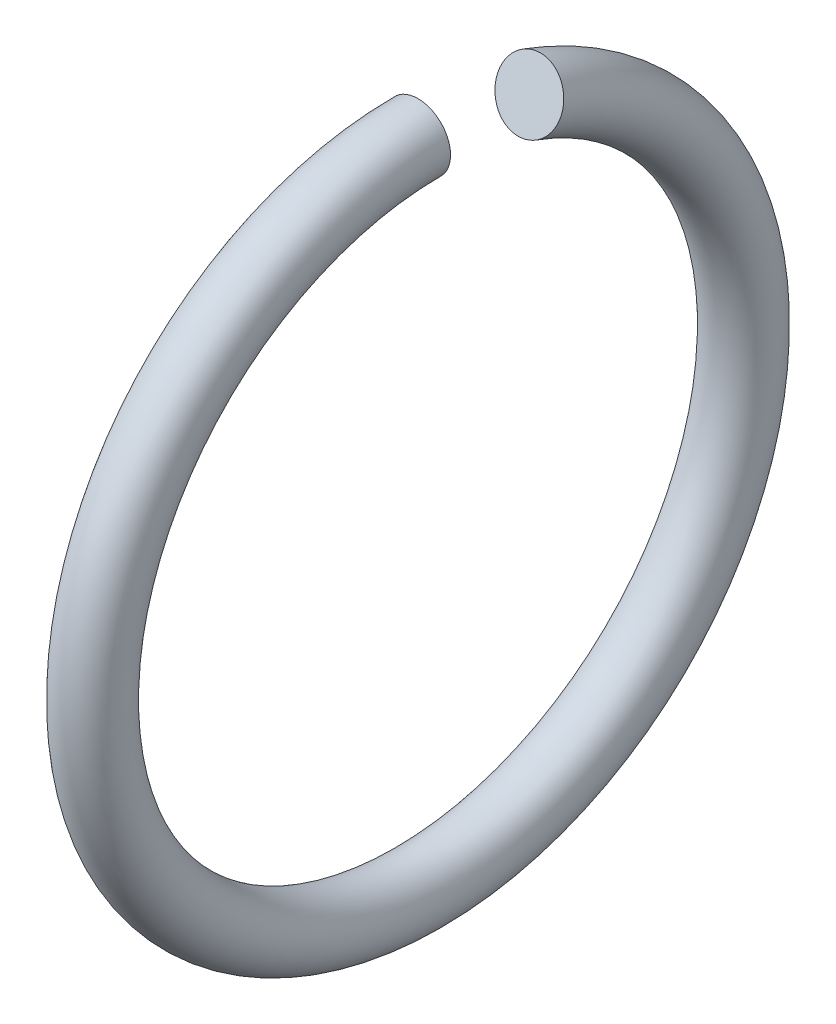
ISO-10303-21;
HEADER;
FILE_DESCRIPTION(('STEP AP214'),'2;1');
FILE_NAME('part.step','',(''),(''),'','','');
FILE_SCHEMA(('AUTOMOTIVE_DESIGN { 1 0 10303 214 1 1 1 1 }'));
ENDSEC;
DATA;
#1=APPLICATION_CONTEXT('core data for automotive mechanical design processes');
#2=APPLICATION_PROTOCOL_DEFINITION('international standard','automotive_design',2000,#1);
#3=PRODUCT_CONTEXT('',#1,'mechanical');
#4=PRODUCT('Part','Part','',(#3));
#5=PRODUCT_RELATED_PRODUCT_CATEGORY('part','',(#4));
#6=PRODUCT_DEFINITION_FORMATION('','',#4);
#7=PRODUCT_DEFINITION_CONTEXT('part definition',#1,'design');
#8=PRODUCT_DEFINITION('design','',#6,#7);
#9=PRODUCT_DEFINITION_SHAPE('','',#8);
#10=(LENGTH_UNIT() NAMED_UNIT(*) SI_UNIT(.MILLI.,.METRE.));
#11=(NAMED_UNIT(*) PLANE_ANGLE_UNIT() SI_UNIT($,.RADIAN.));
#12=(NAMED_UNIT(*) SI_UNIT($,.STERADIAN.) SOLID_ANGLE_UNIT());
#13=UNCERTAINTY_MEASURE_WITH_UNIT(LENGTH_MEASURE(1.E-05),#10,'distance_accuracy_value','');
#14=(GEOMETRIC_REPRESENTATION_CONTEXT(3) GLOBAL_UNCERTAINTY_ASSIGNED_CONTEXT((#13)) GLOBAL_UNIT_ASSIGNED_CONTEXT((#10,
#11,#12)) REPRESENTATION_CONTEXT('',''));
#15=CARTESIAN_POINT('',(0.,0.,0.));
#16=DIRECTION('',(0.,0.,1.));
#17=DIRECTION('',(1.,0.,0.));
#18=AXIS2_PLACEMENT_3D('',#15,#16,#17);
#19=CARTESIAN_POINT('',(0.,0.,0.));
#20=DIRECTION('',(-1.,0.,0.));
#21=DIRECTION('',(0.,0.,1.));
#22=AXIS2_PLACEMENT_3D('',#19,#20,#21);
#23=TOROIDAL_SURFACE('',#22,15.,1.5);
#24=CARTESIAN_POINT('',(0.,14.0953893117887,-5.13030214988485));
#25=DIRECTION('',(0.,0.342020143325657,0.939692620785913));
#26=DIRECTION('',(1.,0.,0.));
#27=AXIS2_PLACEMENT_3D('',#24,#25,#26);
#28=CIRCLE('',#27,1.5);
#29=CARTESIAN_POINT('',(0.,15.5049282429676,-5.64333236487334));
#30=VERTEX_POINT('',#29);
#31=EDGE_CURVE('E10',#30,#30,#28,.T.);
#32=CARTESIAN_POINT('',(0.,15.,0.));
#33=DIRECTION('',(0.,0.,1.));
#34=DIRECTION('',(1.,0.,0.));
#35=AXIS2_PLACEMENT_3D('',#32,#33,#34);
#36=CIRCLE('',#35,1.5);
#37=CARTESIAN_POINT('',(0.,16.5,0.));
#38=VERTEX_POINT('',#37);
#39=EDGE_CURVE('E354',#38,#38,#36,.T.);
#40=CARTESIAN_POINT('',(0.,0.,0.));
#41=DIRECTION('',(-1.,0.,0.));
#42=DIRECTION('',(0.,0.,1.));
#43=AXIS2_PLACEMENT_3D('',#40,#41,#42);
#44=CIRCLE('',#43,16.5);
#45=EDGE_CURVE('',#30,#38,#44,.T.);
#46=ORIENTED_EDGE('',*,*,#31,.F.);
#47=ORIENTED_EDGE('',*,*,#39,.T.);
#48=ORIENTED_EDGE('',*,*,#45,.T.);
#49=ORIENTED_EDGE('',*,*,#45,.F.);
#50=EDGE_LOOP('',(#46,#48,#47,#49));
#51=FACE_BOUND('',#50,.T.);
#52=ADVANCED_FACE('F348',(#51),#23,.T.);
#53=CARTESIAN_POINT('',(0.,14.0953893117887,-5.13030214988485));
#54=DIRECTION('',(0.,0.342020143325657,0.939692620785913));
#55=DIRECTION('',(1.,0.,0.));
#56=AXIS2_PLACEMENT_3D('',#53,#54,#55);
#57=PLANE('',#56);
#58=ORIENTED_EDGE('',*,*,#31,.T.);
#59=EDGE_LOOP('',(#58));
#60=FACE_BOUND('',#59,.T.);
#61=ADVANCED_FACE('F363',(#60),#57,.T.);
#62=CARTESIAN_POINT('',(0.,15.,0.));
#63=DIRECTION('',(0.,0.,1.));
#64=DIRECTION('',(1.,0.,0.));
#65=AXIS2_PLACEMENT_3D('',#62,#63,#64);
#66=PLANE('',#65);
#67=ORIENTED_EDGE('',*,*,#39,.F.);
#68=EDGE_LOOP('',(#67));
#69=FACE_BOUND('',#68,.T.);
#70=ADVANCED_FACE('F361',(#69),#66,.F.);
#71=CLOSED_SHELL('',(#52,#61,#70));
#72=MANIFOLD_SOLID_BREP('B2',#71);
#73=ADVANCED_BREP_SHAPE_REPRESENTATION('',(#18,#72),#14);
#74=SHAPE_DEFINITION_REPRESENTATION(#9,#73);
ENDSEC;
END-ISO-10303-21;
